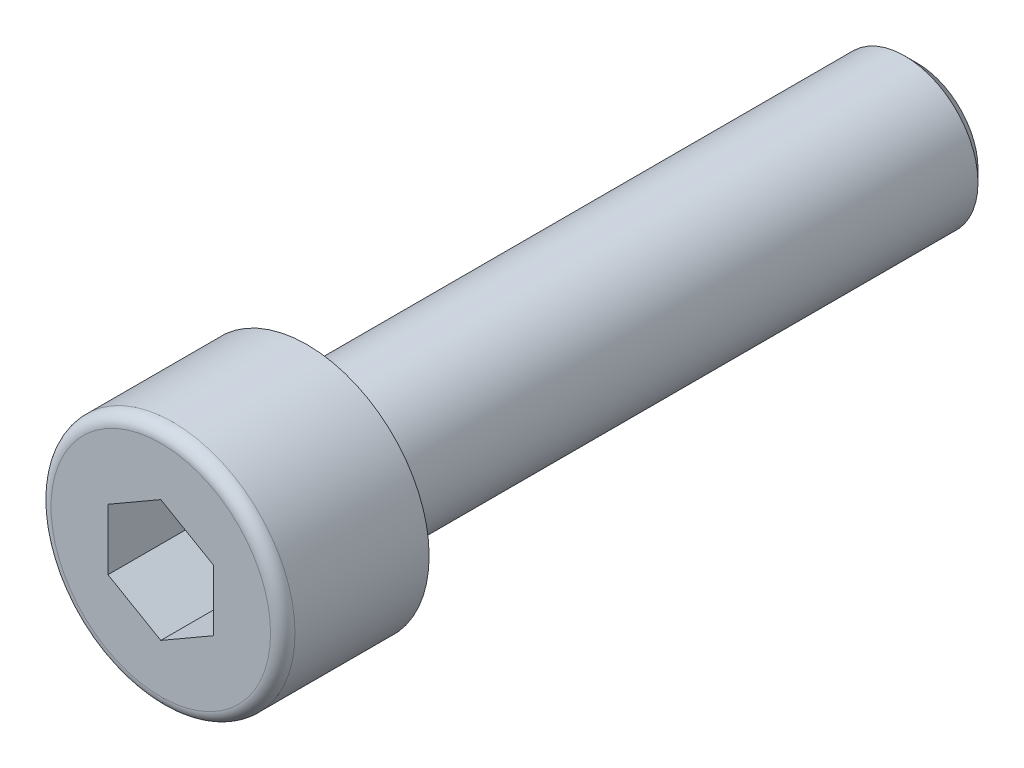
ISO-10303-21;
HEADER;
FILE_DESCRIPTION(('STEP AP214'),'2;1');
FILE_NAME('part.step','',(''),(''),'','','');
FILE_SCHEMA(('AUTOMOTIVE_DESIGN { 1 0 10303 214 1 1 1 1 }'));
ENDSEC;
DATA;
#1=APPLICATION_CONTEXT('core data for automotive mechanical design processes');
#2=APPLICATION_PROTOCOL_DEFINITION('international standard','automotive_design',2000,#1);
#3=PRODUCT_CONTEXT('',#1,'mechanical');
#4=PRODUCT('Part','Part','',(#3));
#5=PRODUCT_RELATED_PRODUCT_CATEGORY('part','',(#4));
#6=PRODUCT_DEFINITION_FORMATION('','',#4);
#7=PRODUCT_DEFINITION_CONTEXT('part definition',#1,'design');
#8=PRODUCT_DEFINITION('design','',#6,#7);
#9=PRODUCT_DEFINITION_SHAPE('','',#8);
#10=(LENGTH_UNIT() NAMED_UNIT(*) SI_UNIT(.MILLI.,.METRE.));
#11=(NAMED_UNIT(*) PLANE_ANGLE_UNIT() SI_UNIT($,.RADIAN.));
#12=(NAMED_UNIT(*) SI_UNIT($,.STERADIAN.) SOLID_ANGLE_UNIT());
#13=UNCERTAINTY_MEASURE_WITH_UNIT(LENGTH_MEASURE(1.E-05),#10,'distance_accuracy_value','');
#14=(GEOMETRIC_REPRESENTATION_CONTEXT(3) GLOBAL_UNCERTAINTY_ASSIGNED_CONTEXT((#13)) GLOBAL_UNIT_ASSIGNED_CONTEXT((#10,
#11,#12)) REPRESENTATION_CONTEXT('',''));
#15=CARTESIAN_POINT('',(0.,0.,0.));
#16=DIRECTION('',(0.,0.,1.));
#17=DIRECTION('',(1.,0.,0.));
#18=AXIS2_PLACEMENT_3D('',#15,#16,#17);
#19=CARTESIAN_POINT('',(0.,0.,25.));
#20=DIRECTION('',(0.,0.,-1.));
#21=DIRECTION('',(-1.,0.,0.));
#22=AXIS2_PLACEMENT_3D('',#19,#20,#21);
#23=CYLINDRICAL_SURFACE('',#22,3.);
#24=CARTESIAN_POINT('',(0.,0.,0.500000000000007));
#25=DIRECTION('',(0.,0.,1.));
#26=DIRECTION('',(1.,0.,0.));
#27=AXIS2_PLACEMENT_3D('',#24,#25,#26);
#28=CIRCLE('',#27,3.);
#29=CARTESIAN_POINT('',(3.,0.,0.500000000000007));
#30=VERTEX_POINT('',#29);
#31=EDGE_CURVE('E42',#30,#30,#28,.T.);
#32=ORIENTED_EDGE('',*,*,#31,.T.);
#33=EDGE_LOOP('',(#32));
#34=FACE_BOUND('',#33,.T.);
#35=CARTESIAN_POINT('',(0.,0.,25.));
#36=DIRECTION('',(0.,0.,1.));
#37=DIRECTION('',(1.,0.,0.));
#38=AXIS2_PLACEMENT_3D('',#35,#36,#37);
#39=CIRCLE('',#38,3.);
#40=CARTESIAN_POINT('',(3.,0.,25.));
#41=VERTEX_POINT('',#40);
#42=EDGE_CURVE('E145',#41,#41,#39,.T.);
#43=ORIENTED_EDGE('',*,*,#42,.F.);
#44=EDGE_LOOP('',(#43));
#45=FACE_BOUND('',#44,.T.);
#46=ADVANCED_FACE('F35',(#34,#45),#23,.T.);
#47=CARTESIAN_POINT('',(0.,0.,0.));
#48=DIRECTION('',(0.,0.,1.));
#49=DIRECTION('',(1.,0.,0.));
#50=AXIS2_PLACEMENT_3D('',#47,#48,#49);
#51=PLANE('',#50);
#52=CARTESIAN_POINT('',(0.,0.,0.));
#53=DIRECTION('',(0.,0.,1.));
#54=DIRECTION('',(1.,0.,0.));
#55=AXIS2_PLACEMENT_3D('',#52,#53,#54);
#56=CIRCLE('',#55,2.5);
#57=CARTESIAN_POINT('',(2.5,0.,0.));
#58=VERTEX_POINT('',#57);
#59=EDGE_CURVE('E11',#58,#58,#56,.F.);
#60=ORIENTED_EDGE('',*,*,#59,.T.);
#61=EDGE_LOOP('',(#60));
#62=FACE_BOUND('',#61,.T.);
#63=ADVANCED_FACE('F171',(#62),#51,.F.);
#64=CARTESIAN_POINT('',(0.,0.,25.));
#65=DIRECTION('',(0.,0.,1.));
#66=DIRECTION('',(1.,0.,0.));
#67=AXIS2_PLACEMENT_3D('',#64,#65,#66);
#68=PLANE('',#67);
#69=CARTESIAN_POINT('',(0.,0.,25.));
#70=DIRECTION('',(0.,0.,1.));
#71=DIRECTION('',(1.,0.,0.));
#72=AXIS2_PLACEMENT_3D('',#69,#70,#71);
#73=CIRCLE('',#72,5.);
#74=CARTESIAN_POINT('',(5.,0.,25.));
#75=VERTEX_POINT('',#74);
#76=EDGE_CURVE('E136',#75,#75,#73,.T.);
#77=ORIENTED_EDGE('',*,*,#76,.F.);
#78=EDGE_LOOP('',(#77));
#79=FACE_BOUND('',#78,.T.);
#80=ORIENTED_EDGE('',*,*,#42,.T.);
#81=EDGE_LOOP('',(#80));
#82=FACE_BOUND('',#81,.T.);
#83=ADVANCED_FACE('F175',(#79,#82),#68,.F.);
#84=CARTESIAN_POINT('',(0.,0.,31.));
#85=DIRECTION('',(0.,0.,-1.));
#86=DIRECTION('',(-1.,0.,0.));
#87=AXIS2_PLACEMENT_3D('',#84,#85,#86);
#88=CYLINDRICAL_SURFACE('',#87,5.);
#89=CARTESIAN_POINT('',(0.,0.,30.5));
#90=DIRECTION('',(0.,0.,1.));
#91=DIRECTION('',(1.,0.,0.));
#92=AXIS2_PLACEMENT_3D('',#89,#90,#91);
#93=CIRCLE('',#92,5.);
#94=CARTESIAN_POINT('',(5.,0.,30.5));
#95=VERTEX_POINT('',#94);
#96=EDGE_CURVE('E151',#95,#95,#93,.F.);
#97=ORIENTED_EDGE('',*,*,#96,.T.);
#98=EDGE_LOOP('',(#97));
#99=FACE_BOUND('',#98,.T.);
#100=ORIENTED_EDGE('',*,*,#76,.T.);
#101=EDGE_LOOP('',(#100));
#102=FACE_BOUND('',#101,.T.);
#103=ADVANCED_FACE('F180',(#99,#102),#88,.T.);
#104=CARTESIAN_POINT('',(0.,0.,31.));
#105=DIRECTION('',(0.,0.,1.));
#106=DIRECTION('',(1.,0.,0.));
#107=AXIS2_PLACEMENT_3D('',#104,#105,#106);
#108=PLANE('',#107);
#109=CARTESIAN_POINT('',(0.,0.,31.));
#110=DIRECTION('',(0.,0.,1.));
#111=DIRECTION('',(1.,0.,0.));
#112=AXIS2_PLACEMENT_3D('',#109,#110,#111);
#113=CIRCLE('',#112,4.5);
#114=CARTESIAN_POINT('',(4.5,0.,31.));
#115=VERTEX_POINT('',#114);
#116=EDGE_CURVE('E148',#115,#115,#113,.T.);
#117=ORIENTED_EDGE('',*,*,#116,.T.);
#118=EDGE_LOOP('',(#117));
#119=FACE_BOUND('',#118,.T.);
#120=DIRECTION('',(-0.866025403784439,0.5,0.));
#121=VECTOR('',#120,1.);
#122=CARTESIAN_POINT('',(2.1650635094611,1.25,31.));
#123=LINE('',#122,#121);
#124=CARTESIAN_POINT('',(2.1650635094611,1.25,31.));
#125=VERTEX_POINT('',#124);
#126=CARTESIAN_POINT('',(0.,2.5,31.));
#127=VERTEX_POINT('',#126);
#128=EDGE_CURVE('E49',#125,#127,#123,.T.);
#129=ORIENTED_EDGE('',*,*,#128,.F.);
#130=DIRECTION('',(0.,1.,0.));
#131=VECTOR('',#130,1.);
#132=CARTESIAN_POINT('',(2.1650635094611,-1.25,31.));
#133=LINE('',#132,#131);
#134=CARTESIAN_POINT('',(2.1650635094611,-1.25,31.));
#135=VERTEX_POINT('',#134);
#136=EDGE_CURVE('E118',#135,#125,#133,.T.);
#137=ORIENTED_EDGE('',*,*,#136,.F.);
#138=DIRECTION('',(0.866025403784439,0.5,0.));
#139=VECTOR('',#138,1.);
#140=CARTESIAN_POINT('',(0.,-2.5,31.));
#141=LINE('',#140,#139);
#142=CARTESIAN_POINT('',(0.,-2.5,31.));
#143=VERTEX_POINT('',#142);
#144=EDGE_CURVE('E112',#143,#135,#141,.T.);
#145=ORIENTED_EDGE('',*,*,#144,.F.);
#146=DIRECTION('',(0.866025403784439,-0.5,0.));
#147=VECTOR('',#146,1.);
#148=CARTESIAN_POINT('',(-2.1650635094611,-1.25,31.));
#149=LINE('',#148,#147);
#150=CARTESIAN_POINT('',(-2.1650635094611,-1.25,31.));
#151=VERTEX_POINT('',#150);
#152=EDGE_CURVE('E110',#151,#143,#149,.T.);
#153=ORIENTED_EDGE('',*,*,#152,.F.);
#154=DIRECTION('',(0.,-1.,0.));
#155=VECTOR('',#154,1.);
#156=CARTESIAN_POINT('',(-2.1650635094611,1.25,31.));
#157=LINE('',#156,#155);
#158=CARTESIAN_POINT('',(-2.1650635094611,1.25,31.));
#159=VERTEX_POINT('',#158);
#160=EDGE_CURVE('E92',#159,#151,#157,.T.);
#161=ORIENTED_EDGE('',*,*,#160,.F.);
#162=DIRECTION('',(-0.866025403784439,-0.5,0.));
#163=VECTOR('',#162,1.);
#164=CARTESIAN_POINT('',(0.,2.5,31.));
#165=LINE('',#164,#163);
#166=EDGE_CURVE('E103',#127,#159,#165,.T.);
#167=ORIENTED_EDGE('',*,*,#166,.F.);
#168=EDGE_LOOP('',(#129,#137,#145,#153,#161,#167));
#169=FACE_BOUND('',#168,.T.);
#170=ADVANCED_FACE('F107',(#119,#169),#108,.T.);
#171=CARTESIAN_POINT('',(2.1650635094611,1.25,27.5));
#172=DIRECTION('',(0.5,0.866025403784439,0.));
#173=DIRECTION('',(-0.866025403784439,0.5,0.));
#174=AXIS2_PLACEMENT_3D('',#171,#172,#173);
#175=PLANE('',#174);
#176=ORIENTED_EDGE('',*,*,#128,.T.);
#177=DIRECTION('',(0.,0.,1.));
#178=VECTOR('',#177,1.);
#179=CARTESIAN_POINT('',(0.,2.5,27.5));
#180=LINE('',#179,#178);
#181=CARTESIAN_POINT('',(0.,2.5,27.5));
#182=VERTEX_POINT('',#181);
#183=EDGE_CURVE('E100',#182,#127,#180,.T.);
#184=ORIENTED_EDGE('',*,*,#183,.F.);
#185=DIRECTION('',(-0.866025403784439,0.5,0.));
#186=VECTOR('',#185,1.);
#187=CARTESIAN_POINT('',(2.1650635094611,1.25,27.5));
#188=LINE('',#187,#186);
#189=CARTESIAN_POINT('',(2.1650635094611,1.25,27.5));
#190=VERTEX_POINT('',#189);
#191=EDGE_CURVE('E120',#190,#182,#188,.T.);
#192=ORIENTED_EDGE('',*,*,#191,.F.);
#193=DIRECTION('',(0.,0.,1.));
#194=VECTOR('',#193,1.);
#195=CARTESIAN_POINT('',(2.1650635094611,1.25,27.5));
#196=LINE('',#195,#194);
#197=EDGE_CURVE('E56',#190,#125,#196,.T.);
#198=ORIENTED_EDGE('',*,*,#197,.T.);
#199=EDGE_LOOP('',(#176,#184,#192,#198));
#200=FACE_BOUND('',#199,.T.);
#201=ADVANCED_FACE('F188',(#200),#175,.F.);
#202=CARTESIAN_POINT('',(2.1650635094611,-1.25,27.5));
#203=DIRECTION('',(1.,0.,0.));
#204=DIRECTION('',(0.,1.,0.));
#205=AXIS2_PLACEMENT_3D('',#202,#203,#204);
#206=PLANE('',#205);
#207=ORIENTED_EDGE('',*,*,#136,.T.);
#208=ORIENTED_EDGE('',*,*,#197,.F.);
#209=DIRECTION('',(0.,1.,0.));
#210=VECTOR('',#209,1.);
#211=CARTESIAN_POINT('',(2.1650635094611,-1.25,27.5));
#212=LINE('',#211,#210);
#213=CARTESIAN_POINT('',(2.1650635094611,-1.25,27.5));
#214=VERTEX_POINT('',#213);
#215=EDGE_CURVE('E132',#214,#190,#212,.T.);
#216=ORIENTED_EDGE('',*,*,#215,.F.);
#217=DIRECTION('',(0.,0.,1.));
#218=VECTOR('',#217,1.);
#219=CARTESIAN_POINT('',(2.1650635094611,-1.25,27.5));
#220=LINE('',#219,#218);
#221=EDGE_CURVE('E137',#214,#135,#220,.T.);
#222=ORIENTED_EDGE('',*,*,#221,.T.);
#223=EDGE_LOOP('',(#207,#208,#216,#222));
#224=FACE_BOUND('',#223,.T.);
#225=ADVANCED_FACE('F193',(#224),#206,.F.);
#226=CARTESIAN_POINT('',(0.,-2.5,27.5));
#227=DIRECTION('',(0.5,-0.866025403784439,0.));
#228=DIRECTION('',(0.866025403784439,0.5,0.));
#229=AXIS2_PLACEMENT_3D('',#226,#227,#228);
#230=PLANE('',#229);
#231=ORIENTED_EDGE('',*,*,#144,.T.);
#232=ORIENTED_EDGE('',*,*,#221,.F.);
#233=DIRECTION('',(0.866025403784439,0.5,0.));
#234=VECTOR('',#233,1.);
#235=CARTESIAN_POINT('',(0.,-2.5,27.5));
#236=LINE('',#235,#234);
#237=CARTESIAN_POINT('',(0.,-2.5,27.5));
#238=VERTEX_POINT('',#237);
#239=EDGE_CURVE('E129',#238,#214,#236,.T.);
#240=ORIENTED_EDGE('',*,*,#239,.F.);
#241=DIRECTION('',(0.,0.,1.));
#242=VECTOR('',#241,1.);
#243=CARTESIAN_POINT('',(0.,-2.5,27.5));
#244=LINE('',#243,#242);
#245=EDGE_CURVE('E139',#238,#143,#244,.T.);
#246=ORIENTED_EDGE('',*,*,#245,.T.);
#247=EDGE_LOOP('',(#231,#232,#240,#246));
#248=FACE_BOUND('',#247,.T.);
#249=ADVANCED_FACE('F201',(#248),#230,.F.);
#250=CARTESIAN_POINT('',(-2.1650635094611,-1.25,27.5));
#251=DIRECTION('',(-0.5,-0.866025403784439,0.));
#252=DIRECTION('',(0.866025403784439,-0.5,0.));
#253=AXIS2_PLACEMENT_3D('',#250,#251,#252);
#254=PLANE('',#253);
#255=ORIENTED_EDGE('',*,*,#152,.T.);
#256=ORIENTED_EDGE('',*,*,#245,.F.);
#257=DIRECTION('',(0.866025403784439,-0.5,0.));
#258=VECTOR('',#257,1.);
#259=CARTESIAN_POINT('',(-2.1650635094611,-1.25,27.5));
#260=LINE('',#259,#258);
#261=CARTESIAN_POINT('',(-2.1650635094611,-1.25,27.5));
#262=VERTEX_POINT('',#261);
#263=EDGE_CURVE('E126',#262,#238,#260,.T.);
#264=ORIENTED_EDGE('',*,*,#263,.F.);
#265=DIRECTION('',(0.,0.,1.));
#266=VECTOR('',#265,1.);
#267=CARTESIAN_POINT('',(-2.1650635094611,-1.25,27.5));
#268=LINE('',#267,#266);
#269=EDGE_CURVE('E99',#262,#151,#268,.T.);
#270=ORIENTED_EDGE('',*,*,#269,.T.);
#271=EDGE_LOOP('',(#255,#256,#264,#270));
#272=FACE_BOUND('',#271,.T.);
#273=ADVANCED_FACE('F198',(#272),#254,.F.);
#274=CARTESIAN_POINT('',(-2.1650635094611,1.25,27.5));
#275=DIRECTION('',(-1.,0.,0.));
#276=DIRECTION('',(0.,-1.,0.));
#277=AXIS2_PLACEMENT_3D('',#274,#275,#276);
#278=PLANE('',#277);
#279=ORIENTED_EDGE('',*,*,#160,.T.);
#280=ORIENTED_EDGE('',*,*,#269,.F.);
#281=DIRECTION('',(0.,-1.,0.));
#282=VECTOR('',#281,1.);
#283=CARTESIAN_POINT('',(-2.1650635094611,1.25,27.5));
#284=LINE('',#283,#282);
#285=CARTESIAN_POINT('',(-2.1650635094611,1.25,27.5));
#286=VERTEX_POINT('',#285);
#287=EDGE_CURVE('E95',#286,#262,#284,.T.);
#288=ORIENTED_EDGE('',*,*,#287,.F.);
#289=DIRECTION('',(0.,0.,1.));
#290=VECTOR('',#289,1.);
#291=CARTESIAN_POINT('',(-2.1650635094611,1.25,27.5));
#292=LINE('',#291,#290);
#293=EDGE_CURVE('E88',#286,#159,#292,.T.);
#294=ORIENTED_EDGE('',*,*,#293,.T.);
#295=EDGE_LOOP('',(#279,#280,#288,#294));
#296=FACE_BOUND('',#295,.T.);
#297=ADVANCED_FACE('F90',(#296),#278,.F.);
#298=CARTESIAN_POINT('',(0.,2.5,27.5));
#299=DIRECTION('',(-0.5,0.866025403784439,0.));
#300=DIRECTION('',(-0.866025403784439,-0.5,0.));
#301=AXIS2_PLACEMENT_3D('',#298,#299,#300);
#302=PLANE('',#301);
#303=ORIENTED_EDGE('',*,*,#166,.T.);
#304=ORIENTED_EDGE('',*,*,#293,.F.);
#305=DIRECTION('',(-0.866025403784439,-0.5,0.));
#306=VECTOR('',#305,1.);
#307=CARTESIAN_POINT('',(0.,2.5,27.5));
#308=LINE('',#307,#306);
#309=EDGE_CURVE('E123',#182,#286,#308,.T.);
#310=ORIENTED_EDGE('',*,*,#309,.F.);
#311=ORIENTED_EDGE('',*,*,#183,.T.);
#312=EDGE_LOOP('',(#303,#304,#310,#311));
#313=FACE_BOUND('',#312,.T.);
#314=ADVANCED_FACE('F104',(#313),#302,.F.);
#315=CARTESIAN_POINT('',(2.1650635094611,1.25,27.5));
#316=DIRECTION('',(0.,0.,-1.));
#317=DIRECTION('',(-1.,0.,0.));
#318=AXIS2_PLACEMENT_3D('',#315,#316,#317);
#319=PLANE('',#318);
#320=ORIENTED_EDGE('',*,*,#191,.T.);
#321=ORIENTED_EDGE('',*,*,#309,.T.);
#322=ORIENTED_EDGE('',*,*,#287,.T.);
#323=ORIENTED_EDGE('',*,*,#263,.T.);
#324=ORIENTED_EDGE('',*,*,#239,.T.);
#325=ORIENTED_EDGE('',*,*,#215,.T.);
#326=EDGE_LOOP('',(#320,#321,#322,#323,#324,#325));
#327=FACE_BOUND('',#326,.T.);
#328=ADVANCED_FACE('F166',(#327),#319,.F.);
#329=CARTESIAN_POINT('',(0.,0.,30.5));
#330=DIRECTION('',(0.,0.,1.));
#331=DIRECTION('',(1.,0.,0.));
#332=AXIS2_PLACEMENT_3D('',#329,#330,#331);
#333=TOROIDAL_SURFACE('',#332,4.5,0.5);
#334=ORIENTED_EDGE('',*,*,#96,.F.);
#335=EDGE_LOOP('',(#334));
#336=FACE_BOUND('',#335,.T.);
#337=ORIENTED_EDGE('',*,*,#116,.F.);
#338=EDGE_LOOP('',(#337));
#339=FACE_BOUND('',#338,.T.);
#340=ADVANCED_FACE('F160',(#336,#339),#333,.T.);
#341=CARTESIAN_POINT('',(0.,0.,0.500000000000007));
#342=DIRECTION('',(0.,0.,1.));
#343=DIRECTION('',(1.,0.,0.));
#344=AXIS2_PLACEMENT_3D('',#341,#342,#343);
#345=CONICAL_SURFACE('',#344,3.,0.785398163397445);
#346=ORIENTED_EDGE('',*,*,#59,.F.);
#347=EDGE_LOOP('',(#346));
#348=FACE_BOUND('',#347,.T.);
#349=ORIENTED_EDGE('',*,*,#31,.F.);
#350=EDGE_LOOP('',(#349));
#351=FACE_BOUND('',#350,.T.);
#352=ADVANCED_FACE('F158',(#348,#351),#345,.T.);
#353=CLOSED_SHELL('',(#46,#63,#83,#103,#170,#201,#225,#249,#273,#297,#314,#328,#340,#352));
#354=MANIFOLD_SOLID_BREP('B2',#353);
#355=ADVANCED_BREP_SHAPE_REPRESENTATION('',(#18,#354),#14);
#356=SHAPE_DEFINITION_REPRESENTATION(#9,#355);
ENDSEC;
END-ISO-10303-21;
